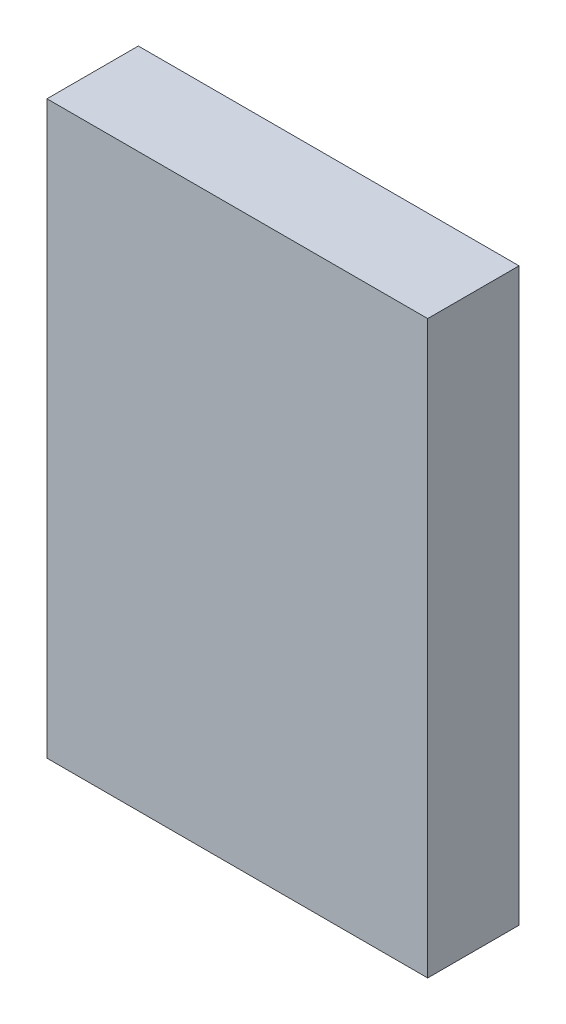
ISO-10303-21;
HEADER;
FILE_DESCRIPTION(('STEP AP214'),'2;1');
FILE_NAME('part.step','',(''),(''),'','','');
FILE_SCHEMA(('AUTOMOTIVE_DESIGN { 1 0 10303 214 1 1 1 1 }'));
ENDSEC;
DATA;
#1=APPLICATION_CONTEXT('core data for automotive mechanical design processes');
#2=APPLICATION_PROTOCOL_DEFINITION('international standard','automotive_design',2000,#1);
#3=PRODUCT_CONTEXT('',#1,'mechanical');
#4=PRODUCT('Part','Part','',(#3));
#5=PRODUCT_RELATED_PRODUCT_CATEGORY('part','',(#4));
#6=PRODUCT_DEFINITION_FORMATION('','',#4);
#7=PRODUCT_DEFINITION_CONTEXT('part definition',#1,'design');
#8=PRODUCT_DEFINITION('design','',#6,#7);
#9=PRODUCT_DEFINITION_SHAPE('','',#8);
#10=(LENGTH_UNIT() NAMED_UNIT(*) SI_UNIT(.MILLI.,.METRE.));
#11=(NAMED_UNIT(*) PLANE_ANGLE_UNIT() SI_UNIT($,.RADIAN.));
#12=(NAMED_UNIT(*) SI_UNIT($,.STERADIAN.) SOLID_ANGLE_UNIT());
#13=UNCERTAINTY_MEASURE_WITH_UNIT(LENGTH_MEASURE(1.E-05),#10,'distance_accuracy_value','');
#14=(GEOMETRIC_REPRESENTATION_CONTEXT(3) GLOBAL_UNCERTAINTY_ASSIGNED_CONTEXT((#13)) GLOBAL_UNIT_ASSIGNED_CONTEXT((#10,
#11,#12)) REPRESENTATION_CONTEXT('',''));
#15=CARTESIAN_POINT('',(0.,0.,0.));
#16=DIRECTION('',(0.,0.,1.));
#17=DIRECTION('',(1.,0.,0.));
#18=AXIS2_PLACEMENT_3D('',#15,#16,#17);
#19=CARTESIAN_POINT('',(0.,0.,3.048));
#20=DIRECTION('',(1.,0.,0.));
#21=DIRECTION('',(0.,0.,-1.));
#22=AXIS2_PLACEMENT_3D('',#19,#20,#21);
#23=PLANE('',#22);
#24=DIRECTION('',(0.,-1.,0.));
#25=VECTOR('',#24,1.);
#26=CARTESIAN_POINT('',(0.,0.,0.));
#27=LINE('',#26,#25);
#28=CARTESIAN_POINT('',(0.,0.,0.));
#29=VERTEX_POINT('',#28);
#30=CARTESIAN_POINT('',(0.,-19.05,0.));
#31=VERTEX_POINT('',#30);
#32=EDGE_CURVE('E80',#29,#31,#27,.T.);
#33=ORIENTED_EDGE('',*,*,#32,.T.);
#34=DIRECTION('',(0.,0.,-1.));
#35=VECTOR('',#34,1.);
#36=CARTESIAN_POINT('',(0.,-19.05,3.048));
#37=LINE('',#36,#35);
#38=CARTESIAN_POINT('',(0.,-19.05,3.048));
#39=VERTEX_POINT('',#38);
#40=EDGE_CURVE('E11',#39,#31,#37,.T.);
#41=ORIENTED_EDGE('',*,*,#40,.F.);
#42=DIRECTION('',(0.,-1.,0.));
#43=VECTOR('',#42,1.);
#44=CARTESIAN_POINT('',(0.,0.,3.048));
#45=LINE('',#44,#43);
#46=CARTESIAN_POINT('',(0.,0.,3.048));
#47=VERTEX_POINT('',#46);
#48=EDGE_CURVE('E68',#47,#39,#45,.T.);
#49=ORIENTED_EDGE('',*,*,#48,.F.);
#50=DIRECTION('',(0.,0.,-1.));
#51=VECTOR('',#50,1.);
#52=CARTESIAN_POINT('',(0.,0.,3.048));
#53=LINE('',#52,#51);
#54=EDGE_CURVE('E76',#47,#29,#53,.T.);
#55=ORIENTED_EDGE('',*,*,#54,.T.);
#56=EDGE_LOOP('',(#33,#41,#49,#55));
#57=FACE_BOUND('',#56,.T.);
#58=ADVANCED_FACE('F17',(#57),#23,.F.);
#59=CARTESIAN_POINT('',(0.,-19.05,3.048));
#60=DIRECTION('',(0.,1.,0.));
#61=DIRECTION('',(0.,0.,1.));
#62=AXIS2_PLACEMENT_3D('',#59,#60,#61);
#63=PLANE('',#62);
#64=DIRECTION('',(1.,0.,0.));
#65=VECTOR('',#64,1.);
#66=CARTESIAN_POINT('',(0.,-19.05,0.));
#67=LINE('',#66,#65);
#68=CARTESIAN_POINT('',(12.7,-19.05,0.));
#69=VERTEX_POINT('',#68);
#70=EDGE_CURVE('E72',#31,#69,#67,.T.);
#71=ORIENTED_EDGE('',*,*,#70,.T.);
#72=DIRECTION('',(0.,0.,-1.));
#73=VECTOR('',#72,1.);
#74=CARTESIAN_POINT('',(12.7,-19.05,3.048));
#75=LINE('',#74,#73);
#76=CARTESIAN_POINT('',(12.7,-19.05,3.048));
#77=VERTEX_POINT('',#76);
#78=EDGE_CURVE('E25',#77,#69,#75,.T.);
#79=ORIENTED_EDGE('',*,*,#78,.F.);
#80=DIRECTION('',(1.,0.,0.));
#81=VECTOR('',#80,1.);
#82=CARTESIAN_POINT('',(0.,-19.05,3.048));
#83=LINE('',#82,#81);
#84=EDGE_CURVE('E63',#39,#77,#83,.T.);
#85=ORIENTED_EDGE('',*,*,#84,.F.);
#86=ORIENTED_EDGE('',*,*,#40,.T.);
#87=EDGE_LOOP('',(#71,#79,#85,#86));
#88=FACE_BOUND('',#87,.T.);
#89=ADVANCED_FACE('F71',(#88),#63,.F.);
#90=CARTESIAN_POINT('',(12.7,0.,3.048));
#91=DIRECTION('',(-1.,0.,0.));
#92=DIRECTION('',(0.,-1.,0.));
#93=AXIS2_PLACEMENT_3D('',#90,#91,#92);
#94=PLANE('',#93);
#95=DIRECTION('',(0.,1.,0.));
#96=VECTOR('',#95,1.);
#97=CARTESIAN_POINT('',(12.7,0.,0.));
#98=LINE('',#97,#96);
#99=CARTESIAN_POINT('',(12.7,0.,0.));
#100=VERTEX_POINT('',#99);
#101=EDGE_CURVE('E50',#69,#100,#98,.T.);
#102=ORIENTED_EDGE('',*,*,#101,.T.);
#103=DIRECTION('',(0.,0.,-1.));
#104=VECTOR('',#103,1.);
#105=CARTESIAN_POINT('',(12.7,0.,3.048));
#106=LINE('',#105,#104);
#107=CARTESIAN_POINT('',(12.7,0.,3.048));
#108=VERTEX_POINT('',#107);
#109=EDGE_CURVE('E73',#108,#100,#106,.T.);
#110=ORIENTED_EDGE('',*,*,#109,.F.);
#111=DIRECTION('',(0.,1.,0.));
#112=VECTOR('',#111,1.);
#113=CARTESIAN_POINT('',(12.7,0.,3.048));
#114=LINE('',#113,#112);
#115=EDGE_CURVE('E66',#77,#108,#114,.T.);
#116=ORIENTED_EDGE('',*,*,#115,.F.);
#117=ORIENTED_EDGE('',*,*,#78,.T.);
#118=EDGE_LOOP('',(#102,#110,#116,#117));
#119=FACE_BOUND('',#118,.T.);
#120=ADVANCED_FACE('F74',(#119),#94,.F.);
#121=CARTESIAN_POINT('',(0.,0.,3.048));
#122=DIRECTION('',(0.,-1.,0.));
#123=DIRECTION('',(0.,0.,-1.));
#124=AXIS2_PLACEMENT_3D('',#121,#122,#123);
#125=PLANE('',#124);
#126=DIRECTION('',(-1.,0.,0.));
#127=VECTOR('',#126,1.);
#128=CARTESIAN_POINT('',(0.,0.,0.));
#129=LINE('',#128,#127);
#130=EDGE_CURVE('E56',#100,#29,#129,.T.);
#131=ORIENTED_EDGE('',*,*,#130,.T.);
#132=ORIENTED_EDGE('',*,*,#54,.F.);
#133=DIRECTION('',(-1.,0.,0.));
#134=VECTOR('',#133,1.);
#135=CARTESIAN_POINT('',(0.,0.,3.048));
#136=LINE('',#135,#134);
#137=EDGE_CURVE('E33',#108,#47,#136,.T.);
#138=ORIENTED_EDGE('',*,*,#137,.F.);
#139=ORIENTED_EDGE('',*,*,#109,.T.);
#140=EDGE_LOOP('',(#131,#132,#138,#139));
#141=FACE_BOUND('',#140,.T.);
#142=ADVANCED_FACE('F87',(#141),#125,.F.);
#143=CARTESIAN_POINT('',(0.,0.,3.048));
#144=DIRECTION('',(0.,0.,1.));
#145=DIRECTION('',(1.,0.,0.));
#146=AXIS2_PLACEMENT_3D('',#143,#144,#145);
#147=PLANE('',#146);
#148=ORIENTED_EDGE('',*,*,#48,.T.);
#149=ORIENTED_EDGE('',*,*,#84,.T.);
#150=ORIENTED_EDGE('',*,*,#115,.T.);
#151=ORIENTED_EDGE('',*,*,#137,.T.);
#152=EDGE_LOOP('',(#148,#149,#150,#151));
#153=FACE_BOUND('',#152,.T.);
#154=ADVANCED_FACE('F64',(#153),#147,.T.);
#155=CARTESIAN_POINT('',(0.,0.,0.));
#156=DIRECTION('',(0.,0.,1.));
#157=DIRECTION('',(1.,0.,0.));
#158=AXIS2_PLACEMENT_3D('',#155,#156,#157);
#159=PLANE('',#158);
#160=ORIENTED_EDGE('',*,*,#32,.F.);
#161=ORIENTED_EDGE('',*,*,#130,.F.);
#162=ORIENTED_EDGE('',*,*,#101,.F.);
#163=ORIENTED_EDGE('',*,*,#70,.F.);
#164=EDGE_LOOP('',(#160,#161,#162,#163));
#165=FACE_BOUND('',#164,.T.);
#166=ADVANCED_FACE('F90',(#165),#159,.F.);
#167=CLOSED_SHELL('',(#58,#89,#120,#142,#154,#166));
#168=MANIFOLD_SOLID_BREP('B1',#167);
#169=ADVANCED_BREP_SHAPE_REPRESENTATION('',(#18,#168),#14);
#170=SHAPE_DEFINITION_REPRESENTATION(#9,#169);
ENDSEC;
END-ISO-10303-21;
